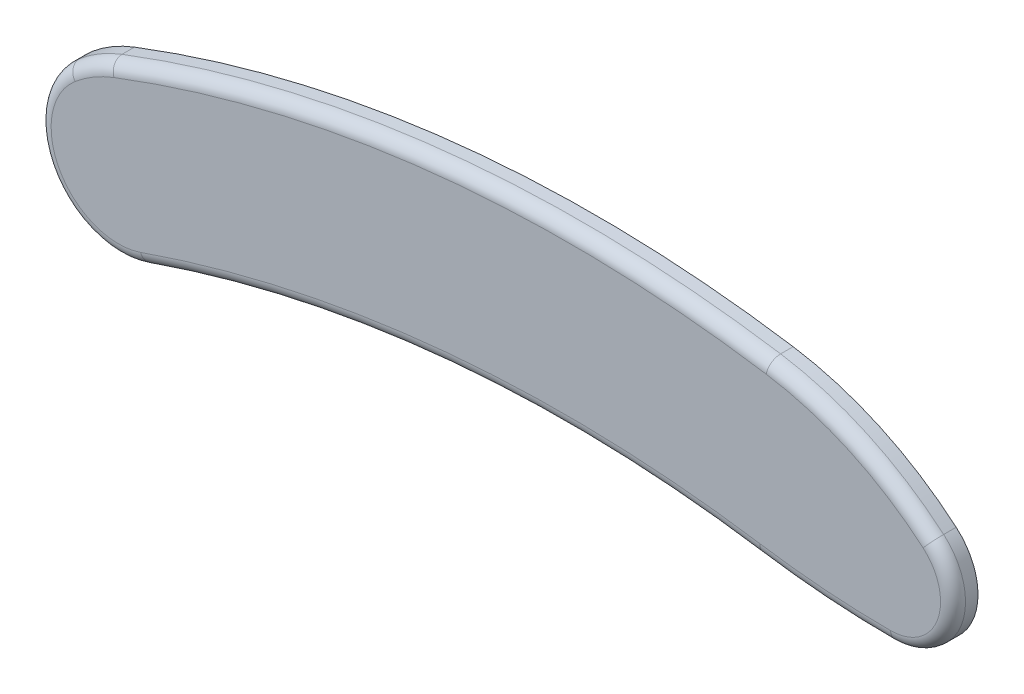
ISO-10303-21;
HEADER;
FILE_DESCRIPTION(('STEP AP214'),'2;1');
FILE_NAME('part.step','',(''),(''),'','','');
FILE_SCHEMA(('AUTOMOTIVE_DESIGN { 1 0 10303 214 1 1 1 1 }'));
ENDSEC;
DATA;
#1=APPLICATION_CONTEXT('core data for automotive mechanical design processes');
#2=APPLICATION_PROTOCOL_DEFINITION('international standard','automotive_design',2000,#1);
#3=PRODUCT_CONTEXT('',#1,'mechanical');
#4=PRODUCT('Part','Part','',(#3));
#5=PRODUCT_RELATED_PRODUCT_CATEGORY('part','',(#4));
#6=PRODUCT_DEFINITION_FORMATION('','',#4);
#7=PRODUCT_DEFINITION_CONTEXT('part definition',#1,'design');
#8=PRODUCT_DEFINITION('design','',#6,#7);
#9=PRODUCT_DEFINITION_SHAPE('','',#8);
#10=(LENGTH_UNIT() NAMED_UNIT(*) SI_UNIT(.MILLI.,.METRE.));
#11=(NAMED_UNIT(*) PLANE_ANGLE_UNIT() SI_UNIT($,.RADIAN.));
#12=(NAMED_UNIT(*) SI_UNIT($,.STERADIAN.) SOLID_ANGLE_UNIT());
#13=UNCERTAINTY_MEASURE_WITH_UNIT(LENGTH_MEASURE(1.E-05),#10,'distance_accuracy_value','');
#14=(GEOMETRIC_REPRESENTATION_CONTEXT(3) GLOBAL_UNCERTAINTY_ASSIGNED_CONTEXT((#13)) GLOBAL_UNIT_ASSIGNED_CONTEXT((#10,
#11,#12)) REPRESENTATION_CONTEXT('',''));
#15=CARTESIAN_POINT('',(0.,0.,0.));
#16=DIRECTION('',(0.,0.,1.));
#17=DIRECTION('',(1.,0.,0.));
#18=AXIS2_PLACEMENT_3D('',#15,#16,#17);
#19=CARTESIAN_POINT('',(-74.7215728623867,1.04234452640998,-2.286));
#20=DIRECTION('',(0.,0.,1.));
#21=DIRECTION('',(1.,0.,0.));
#22=AXIS2_PLACEMENT_3D('',#19,#20,#21);
#23=CYLINDRICAL_SURFACE('',#22,33.3863887810395);
#24=DIRECTION('',(0.,0.,1.));
#25=VECTOR('',#24,1.);
#26=CARTESIAN_POINT('',(-69.6157277483273,34.036,-2.286));
#27=LINE('',#26,#25);
#28=CARTESIAN_POINT('',(-69.6157277483273,34.036,-2.286));
#29=VERTEX_POINT('',#28);
#30=CARTESIAN_POINT('',(-69.6157277483273,34.036,-1.016));
#31=VERTEX_POINT('',#30);
#32=EDGE_CURVE('E247',#29,#31,#27,.T.);
#33=ORIENTED_EDGE('',*,*,#32,.T.);
#34=CARTESIAN_POINT('',(-74.7215728623867,1.04234452640998,-1.016));
#35=DIRECTION('',(0.,0.,-1.));
#36=DIRECTION('',(-1.,0.,0.));
#37=AXIS2_PLACEMENT_3D('',#34,#35,#36);
#38=CIRCLE('',#37,33.3863887810395);
#39=CARTESIAN_POINT('',(-53.0229884904449,26.416,-1.016));
#40=VERTEX_POINT('',#39);
#41=EDGE_CURVE('E159',#31,#40,#38,.T.);
#42=ORIENTED_EDGE('',*,*,#41,.T.);
#43=DIRECTION('',(0.,0.,1.));
#44=VECTOR('',#43,1.);
#45=CARTESIAN_POINT('',(-53.0229884904449,26.416,-2.286));
#46=LINE('',#45,#44);
#47=CARTESIAN_POINT('',(-53.0229884904449,26.416,-2.286));
#48=VERTEX_POINT('',#47);
#49=EDGE_CURVE('E139',#48,#40,#46,.T.);
#50=ORIENTED_EDGE('',*,*,#49,.F.);
#51=CARTESIAN_POINT('',(-74.7215728623867,1.04234452640998,-2.286));
#52=DIRECTION('',(0.,0.,-1.));
#53=DIRECTION('',(-1.,0.,0.));
#54=AXIS2_PLACEMENT_3D('',#51,#52,#53);
#55=CIRCLE('',#54,33.3863887810395);
#56=EDGE_CURVE('E147',#29,#48,#55,.T.);
#57=ORIENTED_EDGE('',*,*,#56,.F.);
#58=EDGE_LOOP('',(#33,#42,#50,#57));
#59=FACE_BOUND('',#58,.T.);
#60=ADVANCED_FACE('F52',(#59),#23,.T.);
#61=CARTESIAN_POINT('',(-57.15,21.59,-2.286));
#62=DIRECTION('',(0.,0.,1.));
#63=DIRECTION('',(1.,0.,0.));
#64=AXIS2_PLACEMENT_3D('',#61,#62,#63);
#65=CYLINDRICAL_SURFACE('',#64,6.35);
#66=ORIENTED_EDGE('',*,*,#49,.T.);
#67=CARTESIAN_POINT('',(-57.15,21.59,-1.016));
#68=DIRECTION('',(0.,0.,-1.));
#69=DIRECTION('',(-1.,0.,0.));
#70=AXIS2_PLACEMENT_3D('',#67,#68,#69);
#71=CIRCLE('',#70,6.35);
#72=CARTESIAN_POINT('',(-57.15,15.24,-1.016));
#73=VERTEX_POINT('',#72);
#74=EDGE_CURVE('E195',#40,#73,#71,.T.);
#75=ORIENTED_EDGE('',*,*,#74,.T.);
#76=DIRECTION('',(0.,0.,1.));
#77=VECTOR('',#76,1.);
#78=CARTESIAN_POINT('',(-57.15,15.24,-2.286));
#79=LINE('',#78,#77);
#80=CARTESIAN_POINT('',(-57.15,15.24,-2.286));
#81=VERTEX_POINT('',#80);
#82=EDGE_CURVE('E142',#81,#73,#79,.T.);
#83=ORIENTED_EDGE('',*,*,#82,.F.);
#84=CARTESIAN_POINT('',(-57.15,21.59,-2.286));
#85=DIRECTION('',(0.,0.,-1.));
#86=DIRECTION('',(-1.,0.,0.));
#87=AXIS2_PLACEMENT_3D('',#84,#85,#86);
#88=CIRCLE('',#87,6.35);
#89=EDGE_CURVE('E135',#48,#81,#88,.T.);
#90=ORIENTED_EDGE('',*,*,#89,.F.);
#91=EDGE_LOOP('',(#66,#75,#83,#90));
#92=FACE_BOUND('',#91,.T.);
#93=ADVANCED_FACE('F137',(#92),#65,.T.);
#94=CARTESIAN_POINT('',(-57.15,104.93375,-2.286));
#95=DIRECTION('',(0.,0.,1.));
#96=DIRECTION('',(1.,0.,0.));
#97=AXIS2_PLACEMENT_3D('',#94,#95,#96);
#98=CYLINDRICAL_SURFACE('',#97,89.6937500000003);
#99=ORIENTED_EDGE('',*,*,#82,.T.);
#100=CARTESIAN_POINT('',(-57.15,104.93375,-1.016));
#101=DIRECTION('',(0.,0.,-1.));
#102=DIRECTION('',(-1.,0.,0.));
#103=AXIS2_PLACEMENT_3D('',#100,#101,#102);
#104=CIRCLE('',#103,89.6937500000003);
#105=CARTESIAN_POINT('',(-70.6119999999999,16.256,-1.016));
#106=VERTEX_POINT('',#105);
#107=EDGE_CURVE('E161',#73,#106,#104,.T.);
#108=ORIENTED_EDGE('',*,*,#107,.T.);
#109=DIRECTION('',(0.,0.,1.));
#110=VECTOR('',#109,1.);
#111=CARTESIAN_POINT('',(-70.6119999999999,16.256,-2.286));
#112=LINE('',#111,#110);
#113=CARTESIAN_POINT('',(-70.6119999999999,16.256,-2.286));
#114=VERTEX_POINT('',#113);
#115=EDGE_CURVE('E170',#114,#106,#112,.T.);
#116=ORIENTED_EDGE('',*,*,#115,.F.);
#117=CARTESIAN_POINT('',(-57.15,104.93375,-2.286));
#118=DIRECTION('',(0.,0.,-1.));
#119=DIRECTION('',(-1.,0.,0.));
#120=AXIS2_PLACEMENT_3D('',#117,#118,#119);
#121=CIRCLE('',#120,89.6937500000003);
#122=EDGE_CURVE('E146',#81,#114,#121,.T.);
#123=ORIENTED_EDGE('',*,*,#122,.F.);
#124=EDGE_LOOP('',(#99,#108,#116,#123));
#125=FACE_BOUND('',#124,.T.);
#126=ADVANCED_FACE('F272',(#125),#98,.T.);
#127=CARTESIAN_POINT('',(-90.1893374241713,-112.705092985167,-2.286));
#128=DIRECTION('',(0.,0.,1.));
#129=DIRECTION('',(1.,0.,0.));
#130=AXIS2_PLACEMENT_3D('',#127,#128,#129);
#131=CYLINDRICAL_SURFACE('',#130,130.438627885105);
#132=ORIENTED_EDGE('',*,*,#115,.T.);
#133=CARTESIAN_POINT('',(-90.1893374241713,-112.705092985167,-1.016));
#134=DIRECTION('',(0.,0.,-1.));
#135=DIRECTION('',(-1.,0.,0.));
#136=AXIS2_PLACEMENT_3D('',#133,#134,#135);
#137=CIRCLE('',#136,130.438627885105);
#138=CARTESIAN_POINT('',(-133.070926792478,10.4834005432333,-1.016));
#139=VERTEX_POINT('',#138);
#140=EDGE_CURVE('E13',#106,#139,#137,.F.);
#141=ORIENTED_EDGE('',*,*,#140,.T.);
#142=DIRECTION('',(0.,0.,1.));
#143=VECTOR('',#142,1.);
#144=CARTESIAN_POINT('',(-133.070926792478,10.4834005432333,-2.286));
#145=LINE('',#144,#143);
#146=CARTESIAN_POINT('',(-133.070926792478,10.4834005432333,-2.286));
#147=VERTEX_POINT('',#146);
#148=EDGE_CURVE('E263',#147,#139,#145,.T.);
#149=ORIENTED_EDGE('',*,*,#148,.F.);
#150=CARTESIAN_POINT('',(-90.1893374241713,-112.705092985167,-2.286));
#151=DIRECTION('',(0.,0.,1.));
#152=DIRECTION('',(-1.,0.,0.));
#153=AXIS2_PLACEMENT_3D('',#150,#151,#152);
#154=CIRCLE('',#153,130.438627885105);
#155=EDGE_CURVE('E270',#114,#147,#154,.T.);
#156=ORIENTED_EDGE('',*,*,#155,.F.);
#157=EDGE_LOOP('',(#132,#141,#149,#156));
#158=FACE_BOUND('',#157,.T.);
#159=ADVANCED_FACE('F269',(#158),#131,.F.);
#160=CARTESIAN_POINT('',(-135.742999966174,18.159624156079,-2.286));
#161=DIRECTION('',(0.,0.,1.));
#162=DIRECTION('',(1.,0.,0.));
#163=AXIS2_PLACEMENT_3D('',#160,#161,#162);
#164=CYLINDRICAL_SURFACE('',#163,8.128);
#165=ORIENTED_EDGE('',*,*,#148,.T.);
#166=CARTESIAN_POINT('',(-135.742999966174,18.159624156079,-1.016));
#167=DIRECTION('',(0.,0.,-1.));
#168=DIRECTION('',(-1.,0.,0.));
#169=AXIS2_PLACEMENT_3D('',#166,#167,#168);
#170=CIRCLE('',#169,8.128);
#171=CARTESIAN_POINT('',(-140.97,24.384,-1.016));
#172=VERTEX_POINT('',#171);
#173=EDGE_CURVE('E62',#139,#172,#170,.T.);
#174=ORIENTED_EDGE('',*,*,#173,.T.);
#175=DIRECTION('',(0.,0.,1.));
#176=VECTOR('',#175,1.);
#177=CARTESIAN_POINT('',(-140.97,24.384,-2.286));
#178=LINE('',#177,#176);
#179=CARTESIAN_POINT('',(-140.97,24.384,-2.286));
#180=VERTEX_POINT('',#179);
#181=EDGE_CURVE('E255',#180,#172,#178,.T.);
#182=ORIENTED_EDGE('',*,*,#181,.F.);
#183=CARTESIAN_POINT('',(-135.742999966174,18.159624156079,-2.286));
#184=DIRECTION('',(0.,0.,-1.));
#185=DIRECTION('',(-1.,0.,0.));
#186=AXIS2_PLACEMENT_3D('',#183,#184,#185);
#187=CIRCLE('',#186,8.128);
#188=EDGE_CURVE('E455',#147,#180,#187,.T.);
#189=ORIENTED_EDGE('',*,*,#188,.F.);
#190=EDGE_LOOP('',(#165,#174,#182,#189));
#191=FACE_BOUND('',#190,.T.);
#192=ADVANCED_FACE('F384',(#191),#164,.T.);
#193=CARTESIAN_POINT('',(-131.267684261023,12.8303632437396,-2.286));
#194=DIRECTION('',(0.,0.,1.));
#195=DIRECTION('',(1.,0.,0.));
#196=AXIS2_PLACEMENT_3D('',#193,#194,#195);
#197=CYLINDRICAL_SURFACE('',#196,15.0871287193557);
#198=ORIENTED_EDGE('',*,*,#181,.T.);
#199=CARTESIAN_POINT('',(-131.267684261023,12.8303632437396,-1.016));
#200=DIRECTION('',(0.,0.,-1.));
#201=DIRECTION('',(-1.,0.,0.));
#202=AXIS2_PLACEMENT_3D('',#199,#200,#201);
#203=CIRCLE('',#202,15.0871287193557);
#204=CARTESIAN_POINT('',(-136.652,26.924,-1.016));
#205=VERTEX_POINT('',#204);
#206=EDGE_CURVE('E203',#172,#205,#203,.T.);
#207=ORIENTED_EDGE('',*,*,#206,.T.);
#208=DIRECTION('',(0.,0.,1.));
#209=VECTOR('',#208,1.);
#210=CARTESIAN_POINT('',(-136.652,26.924,-2.286));
#211=LINE('',#210,#209);
#212=CARTESIAN_POINT('',(-136.652,26.924,-2.286));
#213=VERTEX_POINT('',#212);
#214=EDGE_CURVE('E249',#213,#205,#211,.T.);
#215=ORIENTED_EDGE('',*,*,#214,.F.);
#216=CARTESIAN_POINT('',(-131.267684261023,12.8303632437396,-2.286));
#217=DIRECTION('',(0.,0.,-1.));
#218=DIRECTION('',(-1.,0.,0.));
#219=AXIS2_PLACEMENT_3D('',#216,#217,#218);
#220=CIRCLE('',#219,15.0871287193557);
#221=EDGE_CURVE('E257',#180,#213,#220,.T.);
#222=ORIENTED_EDGE('',*,*,#221,.F.);
#223=EDGE_LOOP('',(#198,#207,#215,#222));
#224=FACE_BOUND('',#223,.T.);
#225=ADVANCED_FACE('F374',(#224),#197,.T.);
#226=CARTESIAN_POINT('',(-89.7250228038504,-95.909021452324,-2.286));
#227=DIRECTION('',(0.,0.,1.));
#228=DIRECTION('',(1.,0.,0.));
#229=AXIS2_PLACEMENT_3D('',#226,#227,#228);
#230=CYLINDRICAL_SURFACE('',#229,131.491795743594);
#231=ORIENTED_EDGE('',*,*,#214,.T.);
#232=CARTESIAN_POINT('',(-89.7250228038504,-95.909021452324,-1.016));
#233=DIRECTION('',(0.,0.,-1.));
#234=DIRECTION('',(-1.,0.,0.));
#235=AXIS2_PLACEMENT_3D('',#232,#233,#234);
#236=CIRCLE('',#235,131.491795743594);
#237=EDGE_CURVE('E200',#205,#31,#236,.T.);
#238=ORIENTED_EDGE('',*,*,#237,.T.);
#239=ORIENTED_EDGE('',*,*,#32,.F.);
#240=CARTESIAN_POINT('',(-89.7250228038504,-95.909021452324,-2.286));
#241=DIRECTION('',(0.,0.,-1.));
#242=DIRECTION('',(-1.,0.,0.));
#243=AXIS2_PLACEMENT_3D('',#240,#241,#242);
#244=CIRCLE('',#243,131.491795743594);
#245=EDGE_CURVE('E152',#213,#29,#244,.T.);
#246=ORIENTED_EDGE('',*,*,#245,.F.);
#247=EDGE_LOOP('',(#231,#238,#239,#246));
#248=FACE_BOUND('',#247,.T.);
#249=ADVANCED_FACE('F246',(#248),#230,.T.);
#250=CARTESIAN_POINT('',(-65.9357864311934,11.316172263205,-2.286));
#251=DIRECTION('',(0.,0.,-1.));
#252=DIRECTION('',(-1.,0.,0.));
#253=AXIS2_PLACEMENT_3D('',#250,#251,#252);
#254=PLANE('',#253);
#255=ORIENTED_EDGE('',*,*,#56,.T.);
#256=ORIENTED_EDGE('',*,*,#89,.T.);
#257=ORIENTED_EDGE('',*,*,#122,.T.);
#258=ORIENTED_EDGE('',*,*,#155,.T.);
#259=ORIENTED_EDGE('',*,*,#188,.T.);
#260=ORIENTED_EDGE('',*,*,#221,.T.);
#261=ORIENTED_EDGE('',*,*,#245,.T.);
#262=EDGE_LOOP('',(#255,#256,#257,#258,#259,#260,#261));
#263=FACE_BOUND('',#262,.T.);
#264=ADVANCED_FACE('F150',(#263),#254,.T.);
#265=CARTESIAN_POINT('',(-65.9357864311934,11.316172263205,0.254));
#266=DIRECTION('',(0.,0.,-1.));
#267=DIRECTION('',(-1.,0.,0.));
#268=AXIS2_PLACEMENT_3D('',#265,#266,#267);
#269=PLANE('',#268);
#270=CARTESIAN_POINT('',(-90.1893374241713,-112.705092985167,0.254));
#271=DIRECTION('',(0.,0.,-1.));
#272=DIRECTION('',(-1.,0.,0.));
#273=AXIS2_PLACEMENT_3D('',#270,#271,#272);
#274=CIRCLE('',#273,131.708627885105);
#275=CARTESIAN_POINT('',(-133.488438225868,11.6828104827404,0.254));
#276=VERTEX_POINT('',#275);
#277=CARTESIAN_POINT('',(-70.4213876106194,17.511614159292,0.254));
#278=VERTEX_POINT('',#277);
#279=EDGE_CURVE('E167',#276,#278,#274,.T.);
#280=ORIENTED_EDGE('',*,*,#279,.T.);
#281=CARTESIAN_POINT('',(-57.15,104.93375,0.254));
#282=DIRECTION('',(0.,0.,-1.));
#283=DIRECTION('',(-1.,0.,0.));
#284=AXIS2_PLACEMENT_3D('',#281,#282,#283);
#285=CIRCLE('',#284,88.4237500000003);
#286=CARTESIAN_POINT('',(-57.15,16.51,0.254));
#287=VERTEX_POINT('',#286);
#288=EDGE_CURVE('E191',#278,#287,#285,.F.);
#289=ORIENTED_EDGE('',*,*,#288,.T.);
#290=CARTESIAN_POINT('',(-57.15,21.59,0.254));
#291=DIRECTION('',(0.,0.,-1.));
#292=DIRECTION('',(-1.,0.,0.));
#293=AXIS2_PLACEMENT_3D('',#290,#291,#292);
#294=CIRCLE('',#293,5.08);
#295=CARTESIAN_POINT('',(-53.8483907923559,25.4508,0.254));
#296=VERTEX_POINT('',#295);
#297=EDGE_CURVE('E188',#287,#296,#294,.F.);
#298=ORIENTED_EDGE('',*,*,#297,.T.);
#299=CARTESIAN_POINT('',(-74.7215728623867,1.04234452640998,0.254));
#300=DIRECTION('',(0.,0.,-1.));
#301=DIRECTION('',(-1.,0.,0.));
#302=AXIS2_PLACEMENT_3D('',#299,#300,#301);
#303=CIRCLE('',#302,32.1163887810395);
#304=CARTESIAN_POINT('',(-69.8099513086346,32.7809393605799,0.254));
#305=VERTEX_POINT('',#304);
#306=EDGE_CURVE('E185',#296,#305,#303,.F.);
#307=ORIENTED_EDGE('',*,*,#306,.T.);
#308=CARTESIAN_POINT('',(-89.7250228038504,-95.909021452324,0.254));
#309=DIRECTION('',(0.,0.,-1.));
#310=DIRECTION('',(-1.,0.,0.));
#311=AXIS2_PLACEMENT_3D('',#308,#309,#310);
#312=CIRCLE('',#311,130.221795743594);
#313=CARTESIAN_POINT('',(-136.19876061193,25.7376298819081,0.254));
#314=VERTEX_POINT('',#313);
#315=EDGE_CURVE('E182',#305,#314,#312,.F.);
#316=ORIENTED_EDGE('',*,*,#315,.T.);
#317=CARTESIAN_POINT('',(-131.267684261023,12.8303632437396,0.254));
#318=DIRECTION('',(0.,0.,-1.));
#319=DIRECTION('',(-1.,0.,0.));
#320=AXIS2_PLACEMENT_3D('',#317,#318,#319);
#321=CIRCLE('',#320,13.8171287193557);
#322=CARTESIAN_POINT('',(-140.153281244715,23.4114412743873,0.254));
#323=VERTEX_POINT('',#322);
#324=EDGE_CURVE('E179',#314,#323,#321,.F.);
#325=ORIENTED_EDGE('',*,*,#324,.T.);
#326=CARTESIAN_POINT('',(-135.742999966174,18.159624156079,0.254));
#327=DIRECTION('',(0.,0.,-1.));
#328=DIRECTION('',(-1.,0.,0.));
#329=AXIS2_PLACEMENT_3D('',#326,#327,#328);
#330=CIRCLE('',#329,6.858);
#331=EDGE_CURVE('E176',#323,#276,#330,.F.);
#332=ORIENTED_EDGE('',*,*,#331,.T.);
#333=EDGE_LOOP('',(#280,#289,#298,#307,#316,#325,#332));
#334=FACE_BOUND('',#333,.T.);
#335=ADVANCED_FACE('F288',(#334),#269,.F.);
#336=CARTESIAN_POINT('',(-89.7250228038504,-95.909021452324,-1.016));
#337=DIRECTION('',(0.,0.,-1.));
#338=DIRECTION('',(-1.,0.,0.));
#339=AXIS2_PLACEMENT_3D('',#336,#337,#338);
#340=TOROIDAL_SURFACE('',#339,130.221795743594,1.27);
#341=CARTESIAN_POINT('',(-69.8099513086346,32.7809393605799,-1.016));
#342=DIRECTION('',(0.98823672395283,-0.152931937249805,0.));
#343=DIRECTION('',(0.152931937249805,0.98823672395283,0.));
#344=AXIS2_PLACEMENT_3D('',#341,#342,#343);
#345=CIRCLE('',#344,1.27);
#346=EDGE_CURVE('E225',#31,#305,#345,.T.);
#347=ORIENTED_EDGE('',*,*,#346,.F.);
#348=ORIENTED_EDGE('',*,*,#237,.F.);
#349=CARTESIAN_POINT('',(-136.19876061193,25.7376298819081,-1.016));
#350=DIRECTION('',(-0.934149699285011,-0.356881407929475,0.));
#351=DIRECTION('',(0.356881407929475,-0.934149699285011,0.));
#352=AXIS2_PLACEMENT_3D('',#349,#350,#351);
#353=CIRCLE('',#352,1.27);
#354=EDGE_CURVE('E56',#314,#205,#353,.T.);
#355=ORIENTED_EDGE('',*,*,#354,.F.);
#356=ORIENTED_EDGE('',*,*,#315,.F.);
#357=EDGE_LOOP('',(#347,#348,#355,#356));
#358=FACE_BOUND('',#357,.T.);
#359=ADVANCED_FACE('F54',(#358),#340,.T.);
#360=CARTESIAN_POINT('',(-131.267684261023,12.8303632437396,-1.016));
#361=DIRECTION('',(0.,0.,-1.));
#362=DIRECTION('',(-1.,0.,0.));
#363=AXIS2_PLACEMENT_3D('',#360,#361,#362);
#364=TOROIDAL_SURFACE('',#363,13.8171287193557,1.27);
#365=ORIENTED_EDGE('',*,*,#354,.T.);
#366=ORIENTED_EDGE('',*,*,#206,.F.);
#367=CARTESIAN_POINT('',(-140.153281244715,23.4114412743873,-1.016));
#368=DIRECTION('',(-0.765794272135951,-0.643085634082872,0.));
#369=DIRECTION('',(0.643085634082872,-0.765794272135951,0.));
#370=AXIS2_PLACEMENT_3D('',#367,#368,#369);
#371=CIRCLE('',#370,1.27);
#372=EDGE_CURVE('E222',#323,#172,#371,.T.);
#373=ORIENTED_EDGE('',*,*,#372,.F.);
#374=ORIENTED_EDGE('',*,*,#324,.F.);
#375=EDGE_LOOP('',(#365,#366,#373,#374));
#376=FACE_BOUND('',#375,.T.);
#377=ADVANCED_FACE('F239',(#376),#364,.T.);
#378=CARTESIAN_POINT('',(-74.7215728623867,1.04234452640998,-1.016));
#379=DIRECTION('',(0.,0.,-1.));
#380=DIRECTION('',(-1.,0.,0.));
#381=AXIS2_PLACEMENT_3D('',#378,#379,#380);
#382=TOROIDAL_SURFACE('',#381,32.1163887810395,1.27);
#383=ORIENTED_EDGE('',*,*,#346,.T.);
#384=ORIENTED_EDGE('',*,*,#306,.F.);
#385=CARTESIAN_POINT('',(-53.8483907923559,25.4508,-1.016));
#386=DIRECTION('',(0.76,-0.649923072370877,0.));
#387=DIRECTION('',(0.649923072370877,0.76,0.));
#388=AXIS2_PLACEMENT_3D('',#385,#386,#387);
#389=CIRCLE('',#388,1.27);
#390=EDGE_CURVE('E218',#40,#296,#389,.T.);
#391=ORIENTED_EDGE('',*,*,#390,.F.);
#392=ORIENTED_EDGE('',*,*,#41,.F.);
#393=EDGE_LOOP('',(#383,#384,#391,#392));
#394=FACE_BOUND('',#393,.T.);
#395=ADVANCED_FACE('F289',(#394),#382,.T.);
#396=CARTESIAN_POINT('',(-135.742999966174,18.159624156079,-1.016));
#397=DIRECTION('',(0.,0.,-1.));
#398=DIRECTION('',(-1.,0.,0.));
#399=AXIS2_PLACEMENT_3D('',#396,#397,#398);
#400=TOROIDAL_SURFACE('',#399,6.858,1.27);
#401=ORIENTED_EDGE('',*,*,#372,.T.);
#402=ORIENTED_EDGE('',*,*,#173,.F.);
#403=CARTESIAN_POINT('',(-133.488438225868,11.6828104827404,-1.016));
#404=DIRECTION('',(0.944417275202477,0.328749160149694,0.));
#405=DIRECTION('',(-0.328749160149694,0.944417275202477,0.));
#406=AXIS2_PLACEMENT_3D('',#403,#404,#405);
#407=CIRCLE('',#406,1.27);
#408=EDGE_CURVE('E214',#276,#139,#407,.T.);
#409=ORIENTED_EDGE('',*,*,#408,.F.);
#410=ORIENTED_EDGE('',*,*,#331,.F.);
#411=EDGE_LOOP('',(#401,#402,#409,#410));
#412=FACE_BOUND('',#411,.T.);
#413=ADVANCED_FACE('F286',(#412),#400,.T.);
#414=CARTESIAN_POINT('',(-57.15,21.59,-1.016));
#415=DIRECTION('',(0.,0.,-1.));
#416=DIRECTION('',(-1.,0.,0.));
#417=AXIS2_PLACEMENT_3D('',#414,#415,#416);
#418=TOROIDAL_SURFACE('',#417,5.08,1.27);
#419=ORIENTED_EDGE('',*,*,#390,.T.);
#420=ORIENTED_EDGE('',*,*,#297,.F.);
#421=CARTESIAN_POINT('',(-57.15,16.51,-1.016));
#422=DIRECTION('',(-1.,0.,0.));
#423=DIRECTION('',(0.,-1.,0.));
#424=AXIS2_PLACEMENT_3D('',#421,#422,#423);
#425=CIRCLE('',#424,1.27);
#426=EDGE_CURVE('E211',#73,#287,#425,.T.);
#427=ORIENTED_EDGE('',*,*,#426,.F.);
#428=ORIENTED_EDGE('',*,*,#74,.F.);
#429=EDGE_LOOP('',(#419,#420,#427,#428));
#430=FACE_BOUND('',#429,.T.);
#431=ADVANCED_FACE('F292',(#430),#418,.T.);
#432=CARTESIAN_POINT('',(-90.1893374241713,-112.705092985167,-1.016));
#433=DIRECTION('',(0.,0.,-1.));
#434=DIRECTION('',(-1.,0.,0.));
#435=AXIS2_PLACEMENT_3D('',#432,#433,#434);
#436=TOROIDAL_SURFACE('',#435,131.708627885105,1.27);
#437=ORIENTED_EDGE('',*,*,#408,.T.);
#438=ORIENTED_EDGE('',*,*,#140,.F.);
#439=CARTESIAN_POINT('',(-70.4213876106194,17.511614159292,-1.016));
#440=DIRECTION('',(0.988672566371681,-0.150088495575222,0.));
#441=DIRECTION('',(0.150088495575222,0.988672566371681,0.));
#442=AXIS2_PLACEMENT_3D('',#439,#440,#441);
#443=CIRCLE('',#442,1.27);
#444=EDGE_CURVE('E208',#278,#106,#443,.T.);
#445=ORIENTED_EDGE('',*,*,#444,.F.);
#446=ORIENTED_EDGE('',*,*,#279,.F.);
#447=EDGE_LOOP('',(#437,#438,#445,#446));
#448=FACE_BOUND('',#447,.T.);
#449=ADVANCED_FACE('F282',(#448),#436,.T.);
#450=CARTESIAN_POINT('',(-57.15,104.93375,-1.016));
#451=DIRECTION('',(0.,0.,-1.));
#452=DIRECTION('',(-1.,0.,0.));
#453=AXIS2_PLACEMENT_3D('',#450,#451,#452);
#454=TOROIDAL_SURFACE('',#453,88.4237500000003,1.27);
#455=ORIENTED_EDGE('',*,*,#426,.T.);
#456=ORIENTED_EDGE('',*,*,#288,.F.);
#457=ORIENTED_EDGE('',*,*,#444,.T.);
#458=ORIENTED_EDGE('',*,*,#107,.F.);
#459=EDGE_LOOP('',(#455,#456,#457,#458));
#460=FACE_BOUND('',#459,.T.);
#461=ADVANCED_FACE('F276',(#460),#454,.T.);
#462=CLOSED_SHELL('',(#60,#93,#126,#159,#192,#225,#249,#264,#335,#359,#377,#395,#413,#431,#449,#461));
#463=MANIFOLD_SOLID_BREP('B2',#462);
#464=ADVANCED_BREP_SHAPE_REPRESENTATION('',(#18,#463),#14);
#465=SHAPE_DEFINITION_REPRESENTATION(#9,#464);
ENDSEC;
END-ISO-10303-21;
